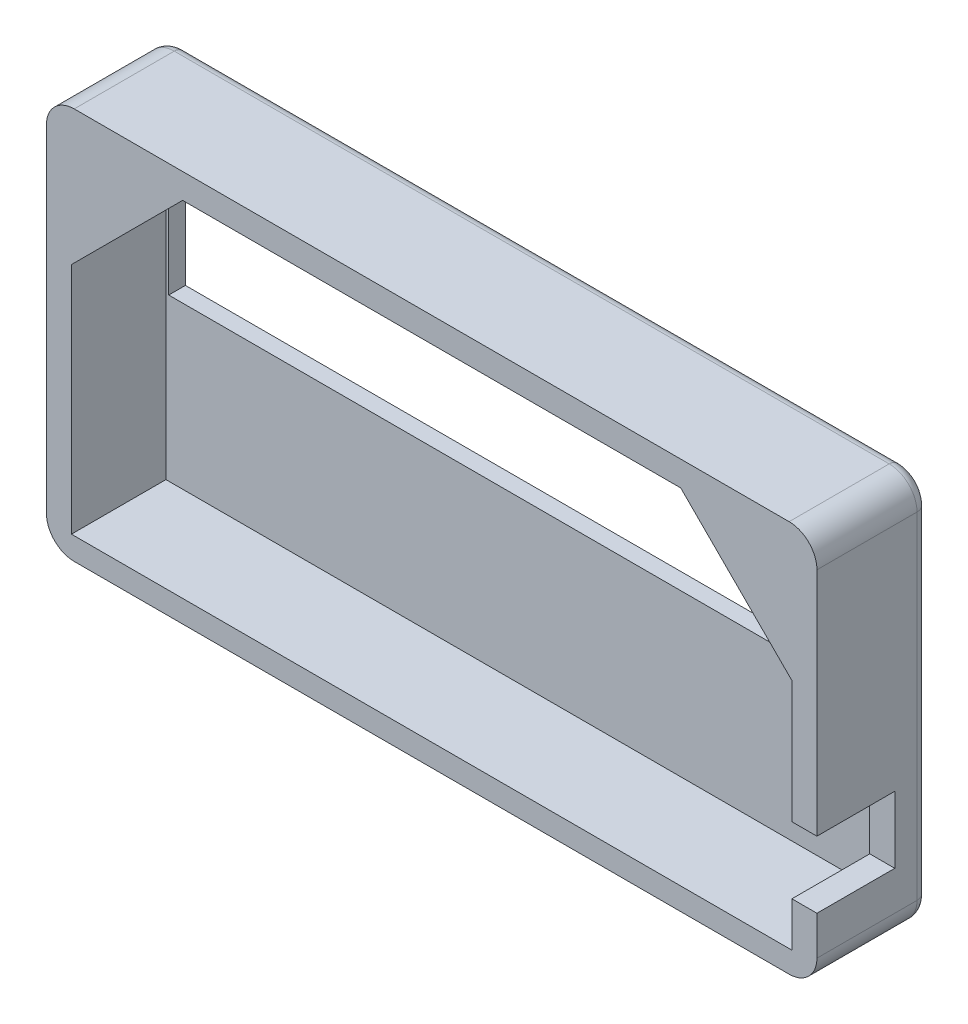
ISO-10303-21;
HEADER;
FILE_DESCRIPTION(('STEP AP214'),'2;1');
FILE_NAME('part.step','',(''),(''),'','','');
FILE_SCHEMA(('AUTOMOTIVE_DESIGN { 1 0 10303 214 1 1 1 1 }'));
ENDSEC;
DATA;
#1=APPLICATION_CONTEXT('core data for automotive mechanical design processes');
#2=APPLICATION_PROTOCOL_DEFINITION('international standard','automotive_design',2000,#1);
#3=PRODUCT_CONTEXT('',#1,'mechanical');
#4=PRODUCT('Part','Part','',(#3));
#5=PRODUCT_RELATED_PRODUCT_CATEGORY('part','',(#4));
#6=PRODUCT_DEFINITION_FORMATION('','',#4);
#7=PRODUCT_DEFINITION_CONTEXT('part definition',#1,'design');
#8=PRODUCT_DEFINITION('design','',#6,#7);
#9=PRODUCT_DEFINITION_SHAPE('','',#8);
#10=(LENGTH_UNIT() NAMED_UNIT(*) SI_UNIT(.MILLI.,.METRE.));
#11=(NAMED_UNIT(*) PLANE_ANGLE_UNIT() SI_UNIT($,.RADIAN.));
#12=(NAMED_UNIT(*) SI_UNIT($,.STERADIAN.) SOLID_ANGLE_UNIT());
#13=UNCERTAINTY_MEASURE_WITH_UNIT(LENGTH_MEASURE(1.E-05),#10,'distance_accuracy_value','');
#14=(GEOMETRIC_REPRESENTATION_CONTEXT(3) GLOBAL_UNCERTAINTY_ASSIGNED_CONTEXT((#13)) GLOBAL_UNIT_ASSIGNED_CONTEXT((#10,
#11,#12)) REPRESENTATION_CONTEXT('',''));
#15=CARTESIAN_POINT('',(0.,0.,0.));
#16=DIRECTION('',(0.,0.,1.));
#17=DIRECTION('',(1.,0.,0.));
#18=AXIS2_PLACEMENT_3D('',#15,#16,#17);
#19=CARTESIAN_POINT('',(48.352508361204,9.56521739130433,20.));
#20=DIRECTION('',(-1.,0.,0.));
#21=DIRECTION('',(0.,0.,1.));
#22=AXIS2_PLACEMENT_3D('',#19,#20,#21);
#23=PLANE('',#22);
#24=DIRECTION('',(0.,0.,-1.));
#25=VECTOR('',#24,1.);
#26=CARTESIAN_POINT('',(48.352508361204,9.56521739130433,20.));
#27=LINE('',#26,#25);
#28=CARTESIAN_POINT('',(48.352508361204,9.56521739130433,3.));
#29=VERTEX_POINT('',#28);
#30=CARTESIAN_POINT('',(48.352508361204,9.56521739130433,0.));
#31=VERTEX_POINT('',#30);
#32=EDGE_CURVE('E338',#29,#31,#27,.T.);
#33=ORIENTED_EDGE('',*,*,#32,.F.);
#34=DIRECTION('',(0.,1.,0.));
#35=VECTOR('',#34,1.);
#36=CARTESIAN_POINT('',(48.352508361204,9.56521739130433,3.));
#37=LINE('',#36,#35);
#38=CARTESIAN_POINT('',(48.352508361204,42.0652173913043,3.));
#39=VERTEX_POINT('',#38);
#40=EDGE_CURVE('E323',#29,#39,#37,.T.);
#41=ORIENTED_EDGE('',*,*,#40,.T.);
#42=DIRECTION('',(0.,0.,-1.));
#43=VECTOR('',#42,1.);
#44=CARTESIAN_POINT('',(48.352508361204,42.0652173913043,20.));
#45=LINE('',#44,#43);
#46=CARTESIAN_POINT('',(48.352508361204,42.0652173913043,0.));
#47=VERTEX_POINT('',#46);
#48=EDGE_CURVE('E344',#39,#47,#45,.T.);
#49=ORIENTED_EDGE('',*,*,#48,.T.);
#50=DIRECTION('',(0.,1.,0.));
#51=VECTOR('',#50,1.);
#52=CARTESIAN_POINT('',(48.352508361204,9.56521739130433,0.));
#53=LINE('',#52,#51);
#54=EDGE_CURVE('E326',#31,#47,#53,.T.);
#55=ORIENTED_EDGE('',*,*,#54,.F.);
#56=EDGE_LOOP('',(#33,#41,#49,#55));
#57=FACE_BOUND('',#56,.T.);
#58=ADVANCED_FACE('F39',(#57),#23,.T.);
#59=CARTESIAN_POINT('',(-80.247491638796,42.0652173913043,20.));
#60=DIRECTION('',(0.,-1.,0.));
#61=DIRECTION('',(0.,0.,-1.));
#62=AXIS2_PLACEMENT_3D('',#59,#60,#61);
#63=PLANE('',#62);
#64=ORIENTED_EDGE('',*,*,#48,.F.);
#65=DIRECTION('',(-1.,0.,0.));
#66=VECTOR('',#65,1.);
#67=CARTESIAN_POINT('',(-80.247491638796,42.0652173913043,3.));
#68=LINE('',#67,#66);
#69=CARTESIAN_POINT('',(-80.247491638796,42.0652173913043,3.));
#70=VERTEX_POINT('',#69);
#71=EDGE_CURVE('E320',#39,#70,#68,.T.);
#72=ORIENTED_EDGE('',*,*,#71,.T.);
#73=DIRECTION('',(0.,0.,-1.));
#74=VECTOR('',#73,1.);
#75=CARTESIAN_POINT('',(-80.247491638796,42.0652173913043,20.));
#76=LINE('',#75,#74);
#77=CARTESIAN_POINT('',(-80.247491638796,42.0652173913043,0.));
#78=VERTEX_POINT('',#77);
#79=EDGE_CURVE('E342',#70,#78,#76,.T.);
#80=ORIENTED_EDGE('',*,*,#79,.T.);
#81=DIRECTION('',(-1.,0.,0.));
#82=VECTOR('',#81,1.);
#83=CARTESIAN_POINT('',(-80.247491638796,42.0652173913043,0.));
#84=LINE('',#83,#82);
#85=EDGE_CURVE('E329',#47,#78,#84,.T.);
#86=ORIENTED_EDGE('',*,*,#85,.F.);
#87=EDGE_LOOP('',(#64,#72,#80,#86));
#88=FACE_BOUND('',#87,.T.);
#89=ADVANCED_FACE('F516',(#88),#63,.T.);
#90=CARTESIAN_POINT('',(-80.247491638796,9.56521739130433,20.));
#91=DIRECTION('',(1.,0.,0.));
#92=DIRECTION('',(0.,0.,-1.));
#93=AXIS2_PLACEMENT_3D('',#90,#91,#92);
#94=PLANE('',#93);
#95=ORIENTED_EDGE('',*,*,#79,.F.);
#96=DIRECTION('',(0.,-1.,0.));
#97=VECTOR('',#96,1.);
#98=CARTESIAN_POINT('',(-80.247491638796,9.56521739130433,3.));
#99=LINE('',#98,#97);
#100=CARTESIAN_POINT('',(-80.247491638796,9.56521739130433,3.));
#101=VERTEX_POINT('',#100);
#102=EDGE_CURVE('E317',#70,#101,#99,.T.);
#103=ORIENTED_EDGE('',*,*,#102,.T.);
#104=DIRECTION('',(0.,0.,-1.));
#105=VECTOR('',#104,1.);
#106=CARTESIAN_POINT('',(-80.247491638796,9.56521739130433,20.));
#107=LINE('',#106,#105);
#108=CARTESIAN_POINT('',(-80.247491638796,9.56521739130433,0.));
#109=VERTEX_POINT('',#108);
#110=EDGE_CURVE('E340',#101,#109,#107,.T.);
#111=ORIENTED_EDGE('',*,*,#110,.T.);
#112=DIRECTION('',(0.,-1.,0.));
#113=VECTOR('',#112,1.);
#114=CARTESIAN_POINT('',(-80.247491638796,9.56521739130433,0.));
#115=LINE('',#114,#113);
#116=EDGE_CURVE('E332',#78,#109,#115,.T.);
#117=ORIENTED_EDGE('',*,*,#116,.F.);
#118=EDGE_LOOP('',(#95,#103,#111,#117));
#119=FACE_BOUND('',#118,.T.);
#120=ADVANCED_FACE('F522',(#119),#94,.T.);
#121=CARTESIAN_POINT('',(-80.247491638796,9.56521739130433,20.));
#122=DIRECTION('',(0.,1.,0.));
#123=DIRECTION('',(0.,0.,1.));
#124=AXIS2_PLACEMENT_3D('',#121,#122,#123);
#125=PLANE('',#124);
#126=ORIENTED_EDGE('',*,*,#110,.F.);
#127=DIRECTION('',(1.,0.,0.));
#128=VECTOR('',#127,1.);
#129=CARTESIAN_POINT('',(-80.247491638796,9.56521739130433,3.));
#130=LINE('',#129,#128);
#131=EDGE_CURVE('E359',#101,#29,#130,.T.);
#132=ORIENTED_EDGE('',*,*,#131,.T.);
#133=ORIENTED_EDGE('',*,*,#32,.T.);
#134=DIRECTION('',(1.,0.,0.));
#135=VECTOR('',#134,1.);
#136=CARTESIAN_POINT('',(-80.247491638796,9.56521739130433,0.));
#137=LINE('',#136,#135);
#138=EDGE_CURVE('E335',#109,#31,#137,.T.);
#139=ORIENTED_EDGE('',*,*,#138,.F.);
#140=EDGE_LOOP('',(#126,#132,#133,#139));
#141=FACE_BOUND('',#140,.T.);
#142=ADVANCED_FACE('F529',(#141),#125,.T.);
#143=CARTESIAN_POINT('',(0.,0.,20.));
#144=DIRECTION('',(0.,0.,1.));
#145=DIRECTION('',(1.,0.,0.));
#146=AXIS2_PLACEMENT_3D('',#143,#144,#145);
#147=PLANE('',#146);
#148=DIRECTION('',(-1.,0.,0.));
#149=VECTOR('',#148,1.);
#150=CARTESIAN_POINT('',(-80.747491638796,42.5652173913043,20.));
#151=LINE('',#150,#149);
#152=CARTESIAN_POINT('',(28.852508361204,42.5652173913043,20.));
#153=VERTEX_POINT('',#152);
#154=CARTESIAN_POINT('',(-60.747491638796,42.5652173913043,20.));
#155=VERTEX_POINT('',#154);
#156=EDGE_CURVE('E305',#153,#155,#151,.T.);
#157=ORIENTED_EDGE('',*,*,#156,.F.);
#158=DIRECTION('',(0.707106781186551,-0.707106781186544,0.));
#159=VECTOR('',#158,1.);
#160=CARTESIAN_POINT('',(28.852508361204,42.5652173913043,20.));
#161=LINE('',#160,#159);
#162=CARTESIAN_POINT('',(48.852508361204,22.5652173913045,20.));
#163=VERTEX_POINT('',#162);
#164=EDGE_CURVE('E236',#153,#163,#161,.T.);
#165=ORIENTED_EDGE('',*,*,#164,.T.);
#166=DIRECTION('',(0.,1.,0.));
#167=VECTOR('',#166,1.);
#168=CARTESIAN_POINT('',(48.852508361204,42.5652173913043,20.));
#169=LINE('',#168,#167);
#170=CARTESIAN_POINT('',(48.852508361204,0.565217391304329,20.));
#171=VERTEX_POINT('',#170);
#172=EDGE_CURVE('E231',#171,#163,#169,.T.);
#173=ORIENTED_EDGE('',*,*,#172,.F.);
#174=DIRECTION('',(-1.,0.,0.));
#175=VECTOR('',#174,1.);
#176=CARTESIAN_POINT('',(53.352508361204,0.565217391304329,20.));
#177=LINE('',#176,#175);
#178=CARTESIAN_POINT('',(53.352508361204,0.565217391304329,20.));
#179=VERTEX_POINT('',#178);
#180=EDGE_CURVE('E265',#179,#171,#177,.T.);
#181=ORIENTED_EDGE('',*,*,#180,.F.);
#182=DIRECTION('',(0.,1.,0.));
#183=VECTOR('',#182,1.);
#184=CARTESIAN_POINT('',(53.352508361204,47.0652173913043,20.));
#185=LINE('',#184,#183);
#186=CARTESIAN_POINT('',(53.352508361204,42.0652173913043,20.));
#187=VERTEX_POINT('',#186);
#188=EDGE_CURVE('E352',#179,#187,#185,.T.);
#189=ORIENTED_EDGE('',*,*,#188,.T.);
#190=CARTESIAN_POINT('',(48.352508361204,42.0652173913043,20.));
#191=DIRECTION('',(0.,0.,1.));
#192=DIRECTION('',(1.,0.,0.));
#193=AXIS2_PLACEMENT_3D('',#190,#191,#192);
#194=CIRCLE('',#193,5.);
#195=CARTESIAN_POINT('',(48.352508361204,47.0652173913043,20.));
#196=VERTEX_POINT('',#195);
#197=EDGE_CURVE('E379',#187,#196,#194,.T.);
#198=ORIENTED_EDGE('',*,*,#197,.T.);
#199=DIRECTION('',(-1.,0.,0.));
#200=VECTOR('',#199,1.);
#201=CARTESIAN_POINT('',(-85.247491638796,47.0652173913043,20.));
#202=LINE('',#201,#200);
#203=CARTESIAN_POINT('',(-80.247491638796,47.0652173913043,20.));
#204=VERTEX_POINT('',#203);
#205=EDGE_CURVE('E356',#196,#204,#202,.T.);
#206=ORIENTED_EDGE('',*,*,#205,.T.);
#207=CARTESIAN_POINT('',(-80.247491638796,42.0652173913043,20.));
#208=DIRECTION('',(0.,0.,1.));
#209=DIRECTION('',(1.,0.,0.));
#210=AXIS2_PLACEMENT_3D('',#207,#208,#209);
#211=CIRCLE('',#210,5.);
#212=CARTESIAN_POINT('',(-85.247491638796,42.0652173913043,20.));
#213=VERTEX_POINT('',#212);
#214=EDGE_CURVE('E377',#204,#213,#211,.T.);
#215=ORIENTED_EDGE('',*,*,#214,.T.);
#216=DIRECTION('',(0.,-1.,0.));
#217=VECTOR('',#216,1.);
#218=CARTESIAN_POINT('',(-85.247491638796,47.0652173913043,20.));
#219=LINE('',#218,#217);
#220=CARTESIAN_POINT('',(-85.247491638796,-18.4347826086957,20.));
#221=VERTEX_POINT('',#220);
#222=EDGE_CURVE('E346',#213,#221,#219,.T.);
#223=ORIENTED_EDGE('',*,*,#222,.T.);
#224=CARTESIAN_POINT('',(-80.247491638796,-18.4347826086957,20.));
#225=DIRECTION('',(0.,0.,1.));
#226=DIRECTION('',(1.,0.,0.));
#227=AXIS2_PLACEMENT_3D('',#224,#225,#226);
#228=CIRCLE('',#227,5.);
#229=CARTESIAN_POINT('',(-80.247491638796,-23.4347826086957,20.));
#230=VERTEX_POINT('',#229);
#231=EDGE_CURVE('E375',#221,#230,#228,.T.);
#232=ORIENTED_EDGE('',*,*,#231,.T.);
#233=DIRECTION('',(1.,0.,0.));
#234=VECTOR('',#233,1.);
#235=CARTESIAN_POINT('',(-85.247491638796,-23.4347826086957,20.));
#236=LINE('',#235,#234);
#237=CARTESIAN_POINT('',(48.352508361204,-23.4347826086957,20.));
#238=VERTEX_POINT('',#237);
#239=EDGE_CURVE('E349',#230,#238,#236,.T.);
#240=ORIENTED_EDGE('',*,*,#239,.T.);
#241=CARTESIAN_POINT('',(48.352508361204,-18.4347826086957,20.));
#242=DIRECTION('',(0.,0.,1.));
#243=DIRECTION('',(1.,0.,0.));
#244=AXIS2_PLACEMENT_3D('',#241,#242,#243);
#245=CIRCLE('',#244,5.);
#246=CARTESIAN_POINT('',(53.352508361204,-18.4347826086957,20.));
#247=VERTEX_POINT('',#246);
#248=EDGE_CURVE('E373',#238,#247,#245,.T.);
#249=ORIENTED_EDGE('',*,*,#248,.T.);
#250=CARTESIAN_POINT('',(53.352508361204,-11.4347826086957,20.));
#251=VERTEX_POINT('',#250);
#252=EDGE_CURVE('E353',#247,#251,#185,.T.);
#253=ORIENTED_EDGE('',*,*,#252,.T.);
#254=DIRECTION('',(1.,0.,0.));
#255=VECTOR('',#254,1.);
#256=CARTESIAN_POINT('',(53.352508361204,-11.4347826086957,20.));
#257=LINE('',#256,#255);
#258=CARTESIAN_POINT('',(48.852508361204,-11.4347826086957,20.));
#259=VERTEX_POINT('',#258);
#260=EDGE_CURVE('E277',#259,#251,#257,.T.);
#261=ORIENTED_EDGE('',*,*,#260,.F.);
#262=CARTESIAN_POINT('',(48.852508361204,-19.4347826086957,20.));
#263=VERTEX_POINT('',#262);
#264=EDGE_CURVE('E302',#263,#259,#169,.T.);
#265=ORIENTED_EDGE('',*,*,#264,.F.);
#266=DIRECTION('',(1.,0.,0.));
#267=VECTOR('',#266,1.);
#268=CARTESIAN_POINT('',(-80.747491638796,-19.4347826086957,20.));
#269=LINE('',#268,#267);
#270=CARTESIAN_POINT('',(-80.747491638796,-19.4347826086957,20.));
#271=VERTEX_POINT('',#270);
#272=EDGE_CURVE('E299',#271,#263,#269,.T.);
#273=ORIENTED_EDGE('',*,*,#272,.F.);
#274=DIRECTION('',(0.,-1.,0.));
#275=VECTOR('',#274,1.);
#276=CARTESIAN_POINT('',(-80.747491638796,42.5652173913043,20.));
#277=LINE('',#276,#275);
#278=CARTESIAN_POINT('',(-80.747491638796,22.5652173913045,20.));
#279=VERTEX_POINT('',#278);
#280=EDGE_CURVE('E297',#279,#271,#277,.T.);
#281=ORIENTED_EDGE('',*,*,#280,.F.);
#282=DIRECTION('',(0.707106781186551,0.707106781186544,0.));
#283=VECTOR('',#282,1.);
#284=CARTESIAN_POINT('',(-60.747491638796,42.5652173913043,20.));
#285=LINE('',#284,#283);
#286=EDGE_CURVE('E241',#279,#155,#285,.T.);
#287=ORIENTED_EDGE('',*,*,#286,.T.);
#288=EDGE_LOOP('',(#157,#165,#173,#181,#189,#198,#206,#215,#223,#232,#240,#249,#253,#261,#265,
#273,#281,#287));
#289=FACE_BOUND('',#288,.T.);
#290=ADVANCED_FACE('F463',(#289),#147,.T.);
#291=CARTESIAN_POINT('',(0.,0.,0.));
#292=DIRECTION('',(0.,0.,1.));
#293=DIRECTION('',(1.,0.,0.));
#294=AXIS2_PLACEMENT_3D('',#291,#292,#293);
#295=PLANE('',#294);
#296=DIRECTION('',(-1.,0.,0.));
#297=VECTOR('',#296,1.);
#298=CARTESIAN_POINT('',(0.,45.0652173913043,0.));
#299=LINE('',#298,#297);
#300=CARTESIAN_POINT('',(-80.247491638796,45.0652173913043,0.));
#301=VERTEX_POINT('',#300);
#302=CARTESIAN_POINT('',(48.352508361204,45.0652173913043,0.));
#303=VERTEX_POINT('',#302);
#304=EDGE_CURVE('E391',#301,#303,#299,.F.);
#305=ORIENTED_EDGE('',*,*,#304,.T.);
#306=CARTESIAN_POINT('',(48.352508361204,42.0652173913043,0.));
#307=DIRECTION('',(0.,0.,1.));
#308=DIRECTION('',(1.,0.,0.));
#309=AXIS2_PLACEMENT_3D('',#306,#307,#308);
#310=CIRCLE('',#309,3.);
#311=CARTESIAN_POINT('',(51.352508361204,42.0652173913043,0.));
#312=VERTEX_POINT('',#311);
#313=EDGE_CURVE('E405',#303,#312,#310,.F.);
#314=ORIENTED_EDGE('',*,*,#313,.T.);
#315=DIRECTION('',(0.,1.,0.));
#316=VECTOR('',#315,1.);
#317=CARTESIAN_POINT('',(51.352508361204,0.,0.));
#318=LINE('',#317,#316);
#319=CARTESIAN_POINT('',(51.352508361204,-18.4347826086957,0.));
#320=VERTEX_POINT('',#319);
#321=EDGE_CURVE('E403',#312,#320,#318,.F.);
#322=ORIENTED_EDGE('',*,*,#321,.T.);
#323=CARTESIAN_POINT('',(48.352508361204,-18.4347826086957,0.));
#324=DIRECTION('',(0.,0.,1.));
#325=DIRECTION('',(1.,0.,0.));
#326=AXIS2_PLACEMENT_3D('',#323,#324,#325);
#327=CIRCLE('',#326,3.);
#328=CARTESIAN_POINT('',(48.352508361204,-21.4347826086957,0.));
#329=VERTEX_POINT('',#328);
#330=EDGE_CURVE('E401',#320,#329,#327,.F.);
#331=ORIENTED_EDGE('',*,*,#330,.T.);
#332=DIRECTION('',(1.,0.,0.));
#333=VECTOR('',#332,1.);
#334=CARTESIAN_POINT('',(0.,-21.4347826086957,0.));
#335=LINE('',#334,#333);
#336=CARTESIAN_POINT('',(-80.247491638796,-21.4347826086957,0.));
#337=VERTEX_POINT('',#336);
#338=EDGE_CURVE('E399',#329,#337,#335,.F.);
#339=ORIENTED_EDGE('',*,*,#338,.T.);
#340=CARTESIAN_POINT('',(-80.247491638796,-18.4347826086957,0.));
#341=DIRECTION('',(0.,0.,1.));
#342=DIRECTION('',(1.,0.,0.));
#343=AXIS2_PLACEMENT_3D('',#340,#341,#342);
#344=CIRCLE('',#343,3.);
#345=CARTESIAN_POINT('',(-83.247491638796,-18.4347826086957,0.));
#346=VERTEX_POINT('',#345);
#347=EDGE_CURVE('E397',#337,#346,#344,.F.);
#348=ORIENTED_EDGE('',*,*,#347,.T.);
#349=DIRECTION('',(0.,-1.,0.));
#350=VECTOR('',#349,1.);
#351=CARTESIAN_POINT('',(-83.247491638796,0.,0.));
#352=LINE('',#351,#350);
#353=CARTESIAN_POINT('',(-83.247491638796,42.0652173913043,0.));
#354=VERTEX_POINT('',#353);
#355=EDGE_CURVE('E395',#346,#354,#352,.F.);
#356=ORIENTED_EDGE('',*,*,#355,.T.);
#357=CARTESIAN_POINT('',(-80.247491638796,42.0652173913043,0.));
#358=DIRECTION('',(0.,0.,1.));
#359=DIRECTION('',(1.,0.,0.));
#360=AXIS2_PLACEMENT_3D('',#357,#358,#359);
#361=CIRCLE('',#360,3.);
#362=EDGE_CURVE('E393',#354,#301,#361,.F.);
#363=ORIENTED_EDGE('',*,*,#362,.T.);
#364=EDGE_LOOP('',(#305,#314,#322,#331,#339,#348,#356,#363));
#365=FACE_BOUND('',#364,.T.);
#366=ORIENTED_EDGE('',*,*,#54,.T.);
#367=ORIENTED_EDGE('',*,*,#85,.T.);
#368=ORIENTED_EDGE('',*,*,#116,.T.);
#369=ORIENTED_EDGE('',*,*,#138,.T.);
#370=EDGE_LOOP('',(#366,#367,#368,#369));
#371=FACE_BOUND('',#370,.T.);
#372=ADVANCED_FACE('F505',(#365,#371),#295,.F.);
#373=CARTESIAN_POINT('',(-85.247491638796,47.0652173913043,20.));
#374=DIRECTION('',(1.,0.,0.));
#375=DIRECTION('',(0.,1.,0.));
#376=AXIS2_PLACEMENT_3D('',#373,#374,#375);
#377=PLANE('',#376);
#378=DIRECTION('',(0.,0.,-1.));
#379=VECTOR('',#378,1.);
#380=CARTESIAN_POINT('',(-85.247491638796,42.0652173913043,20.));
#381=LINE('',#380,#379);
#382=CARTESIAN_POINT('',(-85.247491638796,42.0652173913043,2.));
#383=VERTEX_POINT('',#382);
#384=EDGE_CURVE('E383',#213,#383,#381,.T.);
#385=ORIENTED_EDGE('',*,*,#384,.T.);
#386=DIRECTION('',(0.,-1.,0.));
#387=VECTOR('',#386,1.);
#388=CARTESIAN_POINT('',(-85.247491638796,47.0652173913043,2.));
#389=LINE('',#388,#387);
#390=CARTESIAN_POINT('',(-85.247491638796,-18.4347826086957,2.));
#391=VERTEX_POINT('',#390);
#392=EDGE_CURVE('E419',#383,#391,#389,.T.);
#393=ORIENTED_EDGE('',*,*,#392,.T.);
#394=DIRECTION('',(0.,0.,-1.));
#395=VECTOR('',#394,1.);
#396=CARTESIAN_POINT('',(-85.247491638796,-18.4347826086957,20.));
#397=LINE('',#396,#395);
#398=EDGE_CURVE('E381',#391,#221,#397,.F.);
#399=ORIENTED_EDGE('',*,*,#398,.T.);
#400=ORIENTED_EDGE('',*,*,#222,.F.);
#401=EDGE_LOOP('',(#385,#393,#399,#400));
#402=FACE_BOUND('',#401,.T.);
#403=ADVANCED_FACE('F503',(#402),#377,.F.);
#404=CARTESIAN_POINT('',(-85.247491638796,-23.4347826086957,20.));
#405=DIRECTION('',(0.,1.,0.));
#406=DIRECTION('',(0.,0.,1.));
#407=AXIS2_PLACEMENT_3D('',#404,#405,#406);
#408=PLANE('',#407);
#409=DIRECTION('',(0.,0.,-1.));
#410=VECTOR('',#409,1.);
#411=CARTESIAN_POINT('',(-80.247491638796,-23.4347826086957,20.));
#412=LINE('',#411,#410);
#413=CARTESIAN_POINT('',(-80.247491638796,-23.4347826086957,2.));
#414=VERTEX_POINT('',#413);
#415=EDGE_CURVE('E388',#230,#414,#412,.T.);
#416=ORIENTED_EDGE('',*,*,#415,.T.);
#417=DIRECTION('',(1.,0.,0.));
#418=VECTOR('',#417,1.);
#419=CARTESIAN_POINT('',(-85.247491638796,-23.4347826086957,2.));
#420=LINE('',#419,#418);
#421=CARTESIAN_POINT('',(48.352508361204,-23.4347826086957,2.));
#422=VERTEX_POINT('',#421);
#423=EDGE_CURVE('E415',#414,#422,#420,.T.);
#424=ORIENTED_EDGE('',*,*,#423,.T.);
#425=DIRECTION('',(0.,0.,-1.));
#426=VECTOR('',#425,1.);
#427=CARTESIAN_POINT('',(48.352508361204,-23.4347826086957,20.));
#428=LINE('',#427,#426);
#429=EDGE_CURVE('E386',#422,#238,#428,.F.);
#430=ORIENTED_EDGE('',*,*,#429,.T.);
#431=ORIENTED_EDGE('',*,*,#239,.F.);
#432=EDGE_LOOP('',(#416,#424,#430,#431));
#433=FACE_BOUND('',#432,.T.);
#434=ADVANCED_FACE('F459',(#433),#408,.F.);
#435=CARTESIAN_POINT('',(53.352508361204,47.0652173913043,20.));
#436=DIRECTION('',(-1.,0.,0.));
#437=DIRECTION('',(0.,-1.,0.));
#438=AXIS2_PLACEMENT_3D('',#435,#436,#437);
#439=PLANE('',#438);
#440=DIRECTION('',(0.,-1.,0.));
#441=VECTOR('',#440,1.);
#442=CARTESIAN_POINT('',(53.352508361204,-11.4347826086957,6.));
#443=LINE('',#442,#441);
#444=CARTESIAN_POINT('',(53.352508361204,0.565217391304329,6.));
#445=VERTEX_POINT('',#444);
#446=CARTESIAN_POINT('',(53.352508361204,-11.4347826086957,6.));
#447=VERTEX_POINT('',#446);
#448=EDGE_CURVE('E272',#445,#447,#443,.T.);
#449=ORIENTED_EDGE('',*,*,#448,.T.);
#450=DIRECTION('',(0.,0.,1.));
#451=VECTOR('',#450,1.);
#452=CARTESIAN_POINT('',(53.352508361204,-11.4347826086957,-9.81600561797629));
#453=LINE('',#452,#451);
#454=EDGE_CURVE('E270',#447,#251,#453,.T.);
#455=ORIENTED_EDGE('',*,*,#454,.T.);
#456=ORIENTED_EDGE('',*,*,#252,.F.);
#457=DIRECTION('',(0.,0.,-1.));
#458=VECTOR('',#457,1.);
#459=CARTESIAN_POINT('',(53.352508361204,-18.4347826086957,20.));
#460=LINE('',#459,#458);
#461=CARTESIAN_POINT('',(53.352508361204,-18.4347826086957,2.));
#462=VERTEX_POINT('',#461);
#463=EDGE_CURVE('E367',#247,#462,#460,.T.);
#464=ORIENTED_EDGE('',*,*,#463,.T.);
#465=DIRECTION('',(0.,1.,0.));
#466=VECTOR('',#465,1.);
#467=CARTESIAN_POINT('',(53.352508361204,47.0652173913043,2.));
#468=LINE('',#467,#466);
#469=CARTESIAN_POINT('',(53.352508361204,42.0652173913043,2.));
#470=VERTEX_POINT('',#469);
#471=EDGE_CURVE('E411',#462,#470,#468,.T.);
#472=ORIENTED_EDGE('',*,*,#471,.T.);
#473=DIRECTION('',(0.,0.,-1.));
#474=VECTOR('',#473,1.);
#475=CARTESIAN_POINT('',(53.352508361204,42.0652173913043,20.));
#476=LINE('',#475,#474);
#477=EDGE_CURVE('E370',#470,#187,#476,.F.);
#478=ORIENTED_EDGE('',*,*,#477,.T.);
#479=ORIENTED_EDGE('',*,*,#188,.F.);
#480=DIRECTION('',(0.,0.,1.));
#481=VECTOR('',#480,1.);
#482=CARTESIAN_POINT('',(53.352508361204,0.565217391304329,-9.81600561797629));
#483=LINE('',#482,#481);
#484=EDGE_CURVE('E279',#445,#179,#483,.T.);
#485=ORIENTED_EDGE('',*,*,#484,.F.);
#486=EDGE_LOOP('',(#449,#455,#456,#464,#472,#478,#479,#485));
#487=FACE_BOUND('',#486,.T.);
#488=ADVANCED_FACE('F472',(#487),#439,.F.);
#489=CARTESIAN_POINT('',(-85.247491638796,47.0652173913043,20.));
#490=DIRECTION('',(0.,-1.,0.));
#491=DIRECTION('',(0.,0.,-1.));
#492=AXIS2_PLACEMENT_3D('',#489,#490,#491);
#493=PLANE('',#492);
#494=DIRECTION('',(0.,0.,-1.));
#495=VECTOR('',#494,1.);
#496=CARTESIAN_POINT('',(48.352508361204,47.0652173913043,20.));
#497=LINE('',#496,#495);
#498=CARTESIAN_POINT('',(48.352508361204,47.0652173913043,2.));
#499=VERTEX_POINT('',#498);
#500=EDGE_CURVE('E364',#196,#499,#497,.T.);
#501=ORIENTED_EDGE('',*,*,#500,.T.);
#502=DIRECTION('',(-1.,0.,0.));
#503=VECTOR('',#502,1.);
#504=CARTESIAN_POINT('',(-85.247491638796,47.0652173913043,2.));
#505=LINE('',#504,#503);
#506=CARTESIAN_POINT('',(-80.247491638796,47.0652173913043,2.));
#507=VERTEX_POINT('',#506);
#508=EDGE_CURVE('E13',#499,#507,#505,.T.);
#509=ORIENTED_EDGE('',*,*,#508,.T.);
#510=DIRECTION('',(0.,0.,-1.));
#511=VECTOR('',#510,1.);
#512=CARTESIAN_POINT('',(-80.247491638796,47.0652173913043,20.));
#513=LINE('',#512,#511);
#514=EDGE_CURVE('E362',#507,#204,#513,.F.);
#515=ORIENTED_EDGE('',*,*,#514,.T.);
#516=ORIENTED_EDGE('',*,*,#205,.F.);
#517=EDGE_LOOP('',(#501,#509,#515,#516));
#518=FACE_BOUND('',#517,.T.);
#519=ADVANCED_FACE('F494',(#518),#493,.F.);
#520=CARTESIAN_POINT('',(-80.747491638796,42.5652173913043,-143.666836813511));
#521=DIRECTION('',(-1.,0.,0.));
#522=DIRECTION('',(0.,-1.,0.));
#523=AXIS2_PLACEMENT_3D('',#520,#521,#522);
#524=PLANE('',#523);
#525=DIRECTION('',(0.,1.,0.));
#526=VECTOR('',#525,1.);
#527=CARTESIAN_POINT('',(-80.747491638796,22.5652173913045,18.));
#528=LINE('',#527,#526);
#529=CARTESIAN_POINT('',(-80.747491638796,22.5652173913045,18.));
#530=VERTEX_POINT('',#529);
#531=CARTESIAN_POINT('',(-80.747491638796,42.5652173913043,18.));
#532=VERTEX_POINT('',#531);
#533=EDGE_CURVE('E256',#530,#532,#528,.T.);
#534=ORIENTED_EDGE('',*,*,#533,.F.);
#535=DIRECTION('',(0.,0.,1.));
#536=VECTOR('',#535,1.);
#537=CARTESIAN_POINT('',(-80.747491638796,22.5652173913045,-25.2842712474618));
#538=LINE('',#537,#536);
#539=EDGE_CURVE('E259',#530,#279,#538,.T.);
#540=ORIENTED_EDGE('',*,*,#539,.T.);
#541=ORIENTED_EDGE('',*,*,#280,.T.);
#542=DIRECTION('',(0.,0.,1.));
#543=VECTOR('',#542,1.);
#544=CARTESIAN_POINT('',(-80.747491638796,-19.4347826086957,-143.666836813511));
#545=LINE('',#544,#543);
#546=CARTESIAN_POINT('',(-80.747491638796,-19.4347826086957,3.));
#547=VERTEX_POINT('',#546);
#548=EDGE_CURVE('E307',#547,#271,#545,.T.);
#549=ORIENTED_EDGE('',*,*,#548,.F.);
#550=DIRECTION('',(0.,1.,0.));
#551=VECTOR('',#550,1.);
#552=CARTESIAN_POINT('',(-80.747491638796,42.5652173913043,3.));
#553=LINE('',#552,#551);
#554=CARTESIAN_POINT('',(-80.747491638796,42.5652173913043,3.));
#555=VERTEX_POINT('',#554);
#556=EDGE_CURVE('E294',#547,#555,#553,.T.);
#557=ORIENTED_EDGE('',*,*,#556,.T.);
#558=DIRECTION('',(0.,0.,1.));
#559=VECTOR('',#558,1.);
#560=CARTESIAN_POINT('',(-80.747491638796,42.5652173913043,-143.666836813511));
#561=LINE('',#560,#559);
#562=EDGE_CURVE('E292',#555,#532,#561,.T.);
#563=ORIENTED_EDGE('',*,*,#562,.T.);
#564=EDGE_LOOP('',(#534,#540,#541,#549,#557,#563));
#565=FACE_BOUND('',#564,.T.);
#566=ADVANCED_FACE('F533',(#565),#524,.F.);
#567=CARTESIAN_POINT('',(-80.747491638796,42.5652173913043,-143.666836813511));
#568=DIRECTION('',(0.,1.,0.));
#569=DIRECTION('',(0.,0.,1.));
#570=AXIS2_PLACEMENT_3D('',#567,#568,#569);
#571=PLANE('',#570);
#572=DIRECTION('',(1.,0.,0.));
#573=VECTOR('',#572,1.);
#574=CARTESIAN_POINT('',(48.852508361204,42.5652173913043,18.));
#575=LINE('',#574,#573);
#576=CARTESIAN_POINT('',(28.852508361204,42.5652173913043,18.));
#577=VERTEX_POINT('',#576);
#578=CARTESIAN_POINT('',(48.852508361204,42.5652173913043,18.));
#579=VERTEX_POINT('',#578);
#580=EDGE_CURVE('E56',#577,#579,#575,.T.);
#581=ORIENTED_EDGE('',*,*,#580,.F.);
#582=DIRECTION('',(0.,0.,1.));
#583=VECTOR('',#582,1.);
#584=CARTESIAN_POINT('',(28.852508361204,42.5652173913043,-25.2842712474618));
#585=LINE('',#584,#583);
#586=EDGE_CURVE('E61',#577,#153,#585,.T.);
#587=ORIENTED_EDGE('',*,*,#586,.T.);
#588=ORIENTED_EDGE('',*,*,#156,.T.);
#589=DIRECTION('',(0.,0.,1.));
#590=VECTOR('',#589,1.);
#591=CARTESIAN_POINT('',(-60.747491638796,42.5652173913043,-25.2842712474618));
#592=LINE('',#591,#590);
#593=CARTESIAN_POINT('',(-60.747491638796,42.5652173913043,18.));
#594=VERTEX_POINT('',#593);
#595=EDGE_CURVE('E253',#594,#155,#592,.T.);
#596=ORIENTED_EDGE('',*,*,#595,.F.);
#597=DIRECTION('',(1.,0.,0.));
#598=VECTOR('',#597,1.);
#599=CARTESIAN_POINT('',(-80.747491638796,42.5652173913043,18.));
#600=LINE('',#599,#598);
#601=EDGE_CURVE('E252',#532,#594,#600,.T.);
#602=ORIENTED_EDGE('',*,*,#601,.F.);
#603=ORIENTED_EDGE('',*,*,#562,.F.);
#604=DIRECTION('',(1.,0.,0.));
#605=VECTOR('',#604,1.);
#606=CARTESIAN_POINT('',(-80.747491638796,42.5652173913043,3.));
#607=LINE('',#606,#605);
#608=CARTESIAN_POINT('',(48.852508361204,42.5652173913043,3.));
#609=VERTEX_POINT('',#608);
#610=EDGE_CURVE('E291',#555,#609,#607,.T.);
#611=ORIENTED_EDGE('',*,*,#610,.T.);
#612=DIRECTION('',(0.,0.,1.));
#613=VECTOR('',#612,1.);
#614=CARTESIAN_POINT('',(48.852508361204,42.5652173913043,-143.666836813511));
#615=LINE('',#614,#613);
#616=EDGE_CURVE('E310',#609,#579,#615,.T.);
#617=ORIENTED_EDGE('',*,*,#616,.T.);
#618=EDGE_LOOP('',(#581,#587,#588,#596,#602,#603,#611,#617));
#619=FACE_BOUND('',#618,.T.);
#620=ADVANCED_FACE('F552',(#619),#571,.F.);
#621=CARTESIAN_POINT('',(48.852508361204,42.5652173913043,-143.666836813511));
#622=DIRECTION('',(1.,0.,0.));
#623=DIRECTION('',(0.,1.,0.));
#624=AXIS2_PLACEMENT_3D('',#621,#622,#623);
#625=PLANE('',#624);
#626=ORIENTED_EDGE('',*,*,#172,.T.);
#627=DIRECTION('',(0.,0.,1.));
#628=VECTOR('',#627,1.);
#629=CARTESIAN_POINT('',(48.852508361204,22.5652173913045,-25.2842712474618));
#630=LINE('',#629,#628);
#631=CARTESIAN_POINT('',(48.852508361204,22.5652173913045,18.));
#632=VERTEX_POINT('',#631);
#633=EDGE_CURVE('E224',#632,#163,#630,.T.);
#634=ORIENTED_EDGE('',*,*,#633,.F.);
#635=DIRECTION('',(0.,-1.,0.));
#636=VECTOR('',#635,1.);
#637=CARTESIAN_POINT('',(48.852508361204,22.5652173913045,18.));
#638=LINE('',#637,#636);
#639=EDGE_CURVE('E228',#579,#632,#638,.T.);
#640=ORIENTED_EDGE('',*,*,#639,.F.);
#641=ORIENTED_EDGE('',*,*,#616,.F.);
#642=DIRECTION('',(0.,-1.,0.));
#643=VECTOR('',#642,1.);
#644=CARTESIAN_POINT('',(48.852508361204,42.5652173913043,3.));
#645=LINE('',#644,#643);
#646=CARTESIAN_POINT('',(48.852508361204,-19.4347826086957,3.));
#647=VERTEX_POINT('',#646);
#648=EDGE_CURVE('E289',#609,#647,#645,.T.);
#649=ORIENTED_EDGE('',*,*,#648,.T.);
#650=DIRECTION('',(0.,0.,1.));
#651=VECTOR('',#650,1.);
#652=CARTESIAN_POINT('',(48.852508361204,-19.4347826086957,-143.666836813511));
#653=LINE('',#652,#651);
#654=EDGE_CURVE('E312',#647,#263,#653,.T.);
#655=ORIENTED_EDGE('',*,*,#654,.T.);
#656=ORIENTED_EDGE('',*,*,#264,.T.);
#657=DIRECTION('',(0.,0.,1.));
#658=VECTOR('',#657,1.);
#659=CARTESIAN_POINT('',(48.852508361204,-11.4347826086957,-9.81600561797629));
#660=LINE('',#659,#658);
#661=CARTESIAN_POINT('',(48.852508361204,-11.4347826086957,6.));
#662=VERTEX_POINT('',#661);
#663=EDGE_CURVE('E282',#662,#259,#660,.T.);
#664=ORIENTED_EDGE('',*,*,#663,.F.);
#665=DIRECTION('',(0.,1.,0.));
#666=VECTOR('',#665,1.);
#667=CARTESIAN_POINT('',(48.852508361204,-11.4347826086957,6.));
#668=LINE('',#667,#666);
#669=CARTESIAN_POINT('',(48.852508361204,0.565217391304329,6.00000000000001));
#670=VERTEX_POINT('',#669);
#671=EDGE_CURVE('E266',#662,#670,#668,.T.);
#672=ORIENTED_EDGE('',*,*,#671,.T.);
#673=DIRECTION('',(0.,0.,1.));
#674=VECTOR('',#673,1.);
#675=CARTESIAN_POINT('',(48.852508361204,0.565217391304329,-9.81600561797629));
#676=LINE('',#675,#674);
#677=EDGE_CURVE('E284',#670,#171,#676,.T.);
#678=ORIENTED_EDGE('',*,*,#677,.T.);
#679=EDGE_LOOP('',(#626,#634,#640,#641,#649,#655,#656,#664,#672,#678));
#680=FACE_BOUND('',#679,.T.);
#681=ADVANCED_FACE('F226',(#680),#625,.F.);
#682=CARTESIAN_POINT('',(-80.747491638796,-19.4347826086957,-143.666836813511));
#683=DIRECTION('',(0.,-1.,0.));
#684=DIRECTION('',(0.,0.,-1.));
#685=AXIS2_PLACEMENT_3D('',#682,#683,#684);
#686=PLANE('',#685);
#687=DIRECTION('',(-1.,0.,0.));
#688=VECTOR('',#687,1.);
#689=CARTESIAN_POINT('',(-80.747491638796,-19.4347826086957,3.));
#690=LINE('',#689,#688);
#691=EDGE_CURVE('E296',#647,#547,#690,.T.);
#692=ORIENTED_EDGE('',*,*,#691,.T.);
#693=ORIENTED_EDGE('',*,*,#548,.T.);
#694=ORIENTED_EDGE('',*,*,#272,.T.);
#695=ORIENTED_EDGE('',*,*,#654,.F.);
#696=EDGE_LOOP('',(#692,#693,#694,#695));
#697=FACE_BOUND('',#696,.T.);
#698=ADVANCED_FACE('F567',(#697),#686,.F.);
#699=CARTESIAN_POINT('',(0.,0.,3.));
#700=DIRECTION('',(0.,0.,1.));
#701=DIRECTION('',(1.,0.,0.));
#702=AXIS2_PLACEMENT_3D('',#699,#700,#701);
#703=PLANE('',#702);
#704=ORIENTED_EDGE('',*,*,#131,.F.);
#705=ORIENTED_EDGE('',*,*,#102,.F.);
#706=ORIENTED_EDGE('',*,*,#71,.F.);
#707=ORIENTED_EDGE('',*,*,#40,.F.);
#708=EDGE_LOOP('',(#704,#705,#706,#707));
#709=FACE_BOUND('',#708,.T.);
#710=ORIENTED_EDGE('',*,*,#556,.F.);
#711=ORIENTED_EDGE('',*,*,#691,.F.);
#712=ORIENTED_EDGE('',*,*,#648,.F.);
#713=ORIENTED_EDGE('',*,*,#610,.F.);
#714=EDGE_LOOP('',(#710,#711,#712,#713));
#715=FACE_BOUND('',#714,.T.);
#716=ADVANCED_FACE('F575',(#709,#715),#703,.T.);
#717=CARTESIAN_POINT('',(48.352508361204,42.0652173913043,20.));
#718=DIRECTION('',(0.,0.,-1.));
#719=DIRECTION('',(-1.,0.,0.));
#720=AXIS2_PLACEMENT_3D('',#717,#718,#719);
#721=CYLINDRICAL_SURFACE('',#720,5.);
#722=ORIENTED_EDGE('',*,*,#477,.F.);
#723=CARTESIAN_POINT('',(48.352508361204,42.0652173913043,2.));
#724=DIRECTION('',(0.,0.,1.));
#725=DIRECTION('',(1.,0.,0.));
#726=AXIS2_PLACEMENT_3D('',#723,#724,#725);
#727=CIRCLE('',#726,5.);
#728=EDGE_CURVE('E408',#470,#499,#727,.T.);
#729=ORIENTED_EDGE('',*,*,#728,.T.);
#730=ORIENTED_EDGE('',*,*,#500,.F.);
#731=ORIENTED_EDGE('',*,*,#197,.F.);
#732=EDGE_LOOP('',(#722,#729,#730,#731));
#733=FACE_BOUND('',#732,.T.);
#734=ADVANCED_FACE('F490',(#733),#721,.T.);
#735=CARTESIAN_POINT('',(-80.247491638796,42.0652173913043,20.));
#736=DIRECTION('',(0.,0.,-1.));
#737=DIRECTION('',(-1.,0.,0.));
#738=AXIS2_PLACEMENT_3D('',#735,#736,#737);
#739=CYLINDRICAL_SURFACE('',#738,5.);
#740=ORIENTED_EDGE('',*,*,#514,.F.);
#741=CARTESIAN_POINT('',(-80.247491638796,42.0652173913043,2.));
#742=DIRECTION('',(0.,0.,1.));
#743=DIRECTION('',(1.,0.,0.));
#744=AXIS2_PLACEMENT_3D('',#741,#742,#743);
#745=CIRCLE('',#744,5.);
#746=EDGE_CURVE('E48',#507,#383,#745,.T.);
#747=ORIENTED_EDGE('',*,*,#746,.T.);
#748=ORIENTED_EDGE('',*,*,#384,.F.);
#749=ORIENTED_EDGE('',*,*,#214,.F.);
#750=EDGE_LOOP('',(#740,#747,#748,#749));
#751=FACE_BOUND('',#750,.T.);
#752=ADVANCED_FACE('F500',(#751),#739,.T.);
#753=CARTESIAN_POINT('',(-80.247491638796,-18.4347826086957,20.));
#754=DIRECTION('',(0.,0.,-1.));
#755=DIRECTION('',(-1.,0.,0.));
#756=AXIS2_PLACEMENT_3D('',#753,#754,#755);
#757=CYLINDRICAL_SURFACE('',#756,5.);
#758=ORIENTED_EDGE('',*,*,#398,.F.);
#759=CARTESIAN_POINT('',(-80.247491638796,-18.4347826086957,2.));
#760=DIRECTION('',(0.,0.,1.));
#761=DIRECTION('',(1.,0.,0.));
#762=AXIS2_PLACEMENT_3D('',#759,#760,#761);
#763=CIRCLE('',#762,5.);
#764=EDGE_CURVE('E417',#391,#414,#763,.T.);
#765=ORIENTED_EDGE('',*,*,#764,.T.);
#766=ORIENTED_EDGE('',*,*,#415,.F.);
#767=ORIENTED_EDGE('',*,*,#231,.F.);
#768=EDGE_LOOP('',(#758,#765,#766,#767));
#769=FACE_BOUND('',#768,.T.);
#770=ADVANCED_FACE('F455',(#769),#757,.T.);
#771=CARTESIAN_POINT('',(48.352508361204,-18.4347826086957,20.));
#772=DIRECTION('',(0.,0.,-1.));
#773=DIRECTION('',(-1.,0.,0.));
#774=AXIS2_PLACEMENT_3D('',#771,#772,#773);
#775=CYLINDRICAL_SURFACE('',#774,5.);
#776=ORIENTED_EDGE('',*,*,#429,.F.);
#777=CARTESIAN_POINT('',(48.352508361204,-18.4347826086957,2.));
#778=DIRECTION('',(0.,0.,1.));
#779=DIRECTION('',(1.,0.,0.));
#780=AXIS2_PLACEMENT_3D('',#777,#778,#779);
#781=CIRCLE('',#780,5.);
#782=EDGE_CURVE('E413',#422,#462,#781,.T.);
#783=ORIENTED_EDGE('',*,*,#782,.T.);
#784=ORIENTED_EDGE('',*,*,#463,.F.);
#785=ORIENTED_EDGE('',*,*,#248,.F.);
#786=EDGE_LOOP('',(#776,#783,#784,#785));
#787=FACE_BOUND('',#786,.T.);
#788=ADVANCED_FACE('F467',(#787),#775,.T.);
#789=CARTESIAN_POINT('',(-80.247491638796,-18.4347826086957,2.));
#790=DIRECTION('',(0.,0.,1.));
#791=DIRECTION('',(1.,0.,0.));
#792=AXIS2_PLACEMENT_3D('',#789,#790,#791);
#793=TOROIDAL_SURFACE('',#792,3.,2.);
#794=CARTESIAN_POINT('',(-80.247491638796,-21.4347826086957,2.));
#795=DIRECTION('',(1.,0.,0.));
#796=DIRECTION('',(0.,0.,-1.));
#797=AXIS2_PLACEMENT_3D('',#794,#795,#796);
#798=CIRCLE('',#797,2.);
#799=EDGE_CURVE('E436',#414,#337,#798,.T.);
#800=ORIENTED_EDGE('',*,*,#799,.F.);
#801=ORIENTED_EDGE('',*,*,#764,.F.);
#802=CARTESIAN_POINT('',(-83.247491638796,-18.4347826086957,2.));
#803=DIRECTION('',(0.,1.,0.));
#804=DIRECTION('',(0.,0.,1.));
#805=AXIS2_PLACEMENT_3D('',#802,#803,#804);
#806=CIRCLE('',#805,2.);
#807=EDGE_CURVE('E43',#346,#391,#806,.T.);
#808=ORIENTED_EDGE('',*,*,#807,.F.);
#809=ORIENTED_EDGE('',*,*,#347,.F.);
#810=EDGE_LOOP('',(#800,#801,#808,#809));
#811=FACE_BOUND('',#810,.T.);
#812=ADVANCED_FACE('F41',(#811),#793,.T.);
#813=CARTESIAN_POINT('',(-83.247491638796,47.0652173913043,2.));
#814=DIRECTION('',(0.,-1.,0.));
#815=DIRECTION('',(1.,0.,0.));
#816=AXIS2_PLACEMENT_3D('',#813,#814,#815);
#817=CYLINDRICAL_SURFACE('',#816,2.);
#818=ORIENTED_EDGE('',*,*,#807,.T.);
#819=ORIENTED_EDGE('',*,*,#392,.F.);
#820=CARTESIAN_POINT('',(-83.247491638796,42.0652173913043,2.));
#821=DIRECTION('',(0.,1.,0.));
#822=DIRECTION('',(0.,0.,1.));
#823=AXIS2_PLACEMENT_3D('',#820,#821,#822);
#824=CIRCLE('',#823,2.);
#825=EDGE_CURVE('E434',#354,#383,#824,.T.);
#826=ORIENTED_EDGE('',*,*,#825,.F.);
#827=ORIENTED_EDGE('',*,*,#355,.F.);
#828=EDGE_LOOP('',(#818,#819,#826,#827));
#829=FACE_BOUND('',#828,.T.);
#830=ADVANCED_FACE('F447',(#829),#817,.T.);
#831=CARTESIAN_POINT('',(-85.247491638796,-21.4347826086957,2.));
#832=DIRECTION('',(1.,0.,0.));
#833=DIRECTION('',(0.,0.,-1.));
#834=AXIS2_PLACEMENT_3D('',#831,#832,#833);
#835=CYLINDRICAL_SURFACE('',#834,2.);
#836=ORIENTED_EDGE('',*,*,#799,.T.);
#837=ORIENTED_EDGE('',*,*,#338,.F.);
#838=CARTESIAN_POINT('',(48.352508361204,-21.4347826086957,2.));
#839=DIRECTION('',(1.,0.,0.));
#840=DIRECTION('',(0.,0.,-1.));
#841=AXIS2_PLACEMENT_3D('',#838,#839,#840);
#842=CIRCLE('',#841,2.);
#843=EDGE_CURVE('E431',#422,#329,#842,.T.);
#844=ORIENTED_EDGE('',*,*,#843,.F.);
#845=ORIENTED_EDGE('',*,*,#423,.F.);
#846=EDGE_LOOP('',(#836,#837,#844,#845));
#847=FACE_BOUND('',#846,.T.);
#848=ADVANCED_FACE('F619',(#847),#835,.T.);
#849=CARTESIAN_POINT('',(-80.247491638796,42.0652173913043,2.));
#850=DIRECTION('',(0.,0.,1.));
#851=DIRECTION('',(1.,0.,0.));
#852=AXIS2_PLACEMENT_3D('',#849,#850,#851);
#853=TOROIDAL_SURFACE('',#852,3.,2.);
#854=ORIENTED_EDGE('',*,*,#825,.T.);
#855=ORIENTED_EDGE('',*,*,#746,.F.);
#856=CARTESIAN_POINT('',(-80.247491638796,45.0652173913043,2.));
#857=DIRECTION('',(1.,0.,0.));
#858=DIRECTION('',(0.,0.,-1.));
#859=AXIS2_PLACEMENT_3D('',#856,#857,#858);
#860=CIRCLE('',#859,2.);
#861=EDGE_CURVE('E428',#301,#507,#860,.T.);
#862=ORIENTED_EDGE('',*,*,#861,.F.);
#863=ORIENTED_EDGE('',*,*,#362,.F.);
#864=EDGE_LOOP('',(#854,#855,#862,#863));
#865=FACE_BOUND('',#864,.T.);
#866=ADVANCED_FACE('F625',(#865),#853,.T.);
#867=CARTESIAN_POINT('',(48.352508361204,-18.4347826086957,2.));
#868=DIRECTION('',(0.,0.,1.));
#869=DIRECTION('',(1.,0.,0.));
#870=AXIS2_PLACEMENT_3D('',#867,#868,#869);
#871=TOROIDAL_SURFACE('',#870,3.,2.);
#872=ORIENTED_EDGE('',*,*,#843,.T.);
#873=ORIENTED_EDGE('',*,*,#330,.F.);
#874=CARTESIAN_POINT('',(51.352508361204,-18.4347826086957,2.));
#875=DIRECTION('',(0.,1.,0.));
#876=DIRECTION('',(0.,0.,1.));
#877=AXIS2_PLACEMENT_3D('',#874,#875,#876);
#878=CIRCLE('',#877,2.);
#879=EDGE_CURVE('E425',#462,#320,#878,.T.);
#880=ORIENTED_EDGE('',*,*,#879,.F.);
#881=ORIENTED_EDGE('',*,*,#782,.F.);
#882=EDGE_LOOP('',(#872,#873,#880,#881));
#883=FACE_BOUND('',#882,.T.);
#884=ADVANCED_FACE('F477',(#883),#871,.T.);
#885=CARTESIAN_POINT('',(-85.247491638796,45.0652173913043,2.));
#886=DIRECTION('',(-1.,0.,0.));
#887=DIRECTION('',(0.,0.,1.));
#888=AXIS2_PLACEMENT_3D('',#885,#886,#887);
#889=CYLINDRICAL_SURFACE('',#888,2.);
#890=ORIENTED_EDGE('',*,*,#861,.T.);
#891=ORIENTED_EDGE('',*,*,#508,.F.);
#892=CARTESIAN_POINT('',(48.352508361204,45.0652173913043,2.));
#893=DIRECTION('',(1.,0.,0.));
#894=DIRECTION('',(0.,0.,-1.));
#895=AXIS2_PLACEMENT_3D('',#892,#893,#894);
#896=CIRCLE('',#895,2.);
#897=EDGE_CURVE('E423',#303,#499,#896,.T.);
#898=ORIENTED_EDGE('',*,*,#897,.F.);
#899=ORIENTED_EDGE('',*,*,#304,.F.);
#900=EDGE_LOOP('',(#890,#891,#898,#899));
#901=FACE_BOUND('',#900,.T.);
#902=ADVANCED_FACE('F639',(#901),#889,.T.);
#903=CARTESIAN_POINT('',(51.352508361204,47.0652173913043,2.));
#904=DIRECTION('',(0.,1.,0.));
#905=DIRECTION('',(-1.,0.,0.));
#906=AXIS2_PLACEMENT_3D('',#903,#904,#905);
#907=CYLINDRICAL_SURFACE('',#906,2.);
#908=ORIENTED_EDGE('',*,*,#879,.T.);
#909=ORIENTED_EDGE('',*,*,#321,.F.);
#910=CARTESIAN_POINT('',(51.352508361204,42.0652173913043,2.));
#911=DIRECTION('',(0.,1.,0.));
#912=DIRECTION('',(0.,0.,1.));
#913=AXIS2_PLACEMENT_3D('',#910,#911,#912);
#914=CIRCLE('',#913,2.);
#915=EDGE_CURVE('E288',#470,#312,#914,.T.);
#916=ORIENTED_EDGE('',*,*,#915,.F.);
#917=ORIENTED_EDGE('',*,*,#471,.F.);
#918=EDGE_LOOP('',(#908,#909,#916,#917));
#919=FACE_BOUND('',#918,.T.);
#920=ADVANCED_FACE('F481',(#919),#907,.T.);
#921=CARTESIAN_POINT('',(48.352508361204,42.0652173913043,2.));
#922=DIRECTION('',(0.,0.,1.));
#923=DIRECTION('',(1.,0.,0.));
#924=AXIS2_PLACEMENT_3D('',#921,#922,#923);
#925=TOROIDAL_SURFACE('',#924,3.,2.);
#926=ORIENTED_EDGE('',*,*,#897,.T.);
#927=ORIENTED_EDGE('',*,*,#728,.F.);
#928=ORIENTED_EDGE('',*,*,#915,.T.);
#929=ORIENTED_EDGE('',*,*,#313,.F.);
#930=EDGE_LOOP('',(#926,#927,#928,#929));
#931=FACE_BOUND('',#930,.T.);
#932=ADVANCED_FACE('F485',(#931),#925,.T.);
#933=CARTESIAN_POINT('',(53.352508361204,-11.4347826086957,-9.81600561797629));
#934=DIRECTION('',(0.,-1.,0.));
#935=DIRECTION('',(0.,0.,-1.));
#936=AXIS2_PLACEMENT_3D('',#933,#934,#935);
#937=PLANE('',#936);
#938=DIRECTION('',(-1.,0.,0.));
#939=VECTOR('',#938,1.);
#940=CARTESIAN_POINT('',(53.352508361204,-11.4347826086957,6.));
#941=LINE('',#940,#939);
#942=EDGE_CURVE('E269',#447,#662,#941,.T.);
#943=ORIENTED_EDGE('',*,*,#942,.T.);
#944=ORIENTED_EDGE('',*,*,#663,.T.);
#945=ORIENTED_EDGE('',*,*,#260,.T.);
#946=ORIENTED_EDGE('',*,*,#454,.F.);
#947=EDGE_LOOP('',(#943,#944,#945,#946));
#948=FACE_BOUND('',#947,.T.);
#949=ADVANCED_FACE('F658',(#948),#937,.F.);
#950=CARTESIAN_POINT('',(53.352508361204,0.565217391304329,-9.81600561797629));
#951=DIRECTION('',(0.,1.,0.));
#952=DIRECTION('',(0.,0.,1.));
#953=AXIS2_PLACEMENT_3D('',#950,#951,#952);
#954=PLANE('',#953);
#955=DIRECTION('',(1.,0.,0.));
#956=VECTOR('',#955,1.);
#957=CARTESIAN_POINT('',(53.352508361204,0.565217391304329,6.));
#958=LINE('',#957,#956);
#959=EDGE_CURVE('E275',#670,#445,#958,.T.);
#960=ORIENTED_EDGE('',*,*,#959,.T.);
#961=ORIENTED_EDGE('',*,*,#484,.T.);
#962=ORIENTED_EDGE('',*,*,#180,.T.);
#963=ORIENTED_EDGE('',*,*,#677,.F.);
#964=EDGE_LOOP('',(#960,#961,#962,#963));
#965=FACE_BOUND('',#964,.T.);
#966=ADVANCED_FACE('F664',(#965),#954,.F.);
#967=CARTESIAN_POINT('',(0.,0.,6.));
#968=DIRECTION('',(0.,0.,1.));
#969=DIRECTION('',(1.,0.,0.));
#970=AXIS2_PLACEMENT_3D('',#967,#968,#969);
#971=PLANE('',#970);
#972=ORIENTED_EDGE('',*,*,#448,.F.);
#973=ORIENTED_EDGE('',*,*,#959,.F.);
#974=ORIENTED_EDGE('',*,*,#671,.F.);
#975=ORIENTED_EDGE('',*,*,#942,.F.);
#976=EDGE_LOOP('',(#972,#973,#974,#975));
#977=FACE_BOUND('',#976,.T.);
#978=ADVANCED_FACE('F672',(#977),#971,.T.);
#979=CARTESIAN_POINT('',(-60.747491638796,42.5652173913043,-25.2842712474618));
#980=DIRECTION('',(0.707106781186544,-0.707106781186551,0.));
#981=DIRECTION('',(0.707106781186551,0.707106781186544,0.));
#982=AXIS2_PLACEMENT_3D('',#979,#980,#981);
#983=PLANE('',#982);
#984=DIRECTION('',(-0.707106781186551,-0.707106781186544,0.));
#985=VECTOR('',#984,1.);
#986=CARTESIAN_POINT('',(-60.747491638796,42.5652173913043,18.));
#987=LINE('',#986,#985);
#988=EDGE_CURVE('E249',#594,#530,#987,.T.);
#989=ORIENTED_EDGE('',*,*,#988,.F.);
#990=ORIENTED_EDGE('',*,*,#595,.T.);
#991=ORIENTED_EDGE('',*,*,#286,.F.);
#992=ORIENTED_EDGE('',*,*,#539,.F.);
#993=EDGE_LOOP('',(#989,#990,#991,#992));
#994=FACE_BOUND('',#993,.T.);
#995=ADVANCED_FACE('F680',(#994),#983,.T.);
#996=CARTESIAN_POINT('',(0.,0.,18.));
#997=DIRECTION('',(0.,0.,1.));
#998=DIRECTION('',(1.,0.,0.));
#999=AXIS2_PLACEMENT_3D('',#996,#997,#998);
#1000=PLANE('',#999);
#1001=ORIENTED_EDGE('',*,*,#601,.T.);
#1002=ORIENTED_EDGE('',*,*,#988,.T.);
#1003=ORIENTED_EDGE('',*,*,#533,.T.);
#1004=EDGE_LOOP('',(#1001,#1002,#1003));
#1005=FACE_BOUND('',#1004,.T.);
#1006=ADVANCED_FACE('F687',(#1005),#1000,.F.);
#1007=CARTESIAN_POINT('',(28.852508361204,42.5652173913043,-25.2842712474618));
#1008=DIRECTION('',(-0.707106781186544,-0.707106781186551,0.));
#1009=DIRECTION('',(0.707106781186551,-0.707106781186544,0.));
#1010=AXIS2_PLACEMENT_3D('',#1007,#1008,#1009);
#1011=PLANE('',#1010);
#1012=DIRECTION('',(-0.707106781186551,0.707106781186544,0.));
#1013=VECTOR('',#1012,1.);
#1014=CARTESIAN_POINT('',(28.852508361204,42.5652173913043,18.));
#1015=LINE('',#1014,#1013);
#1016=EDGE_CURVE('E240',#632,#577,#1015,.T.);
#1017=ORIENTED_EDGE('',*,*,#1016,.F.);
#1018=ORIENTED_EDGE('',*,*,#633,.T.);
#1019=ORIENTED_EDGE('',*,*,#164,.F.);
#1020=ORIENTED_EDGE('',*,*,#586,.F.);
#1021=EDGE_LOOP('',(#1017,#1018,#1019,#1020));
#1022=FACE_BOUND('',#1021,.T.);
#1023=ADVANCED_FACE('F243',(#1022),#1011,.T.);
#1024=CARTESIAN_POINT('',(0.,0.,18.));
#1025=DIRECTION('',(0.,0.,1.));
#1026=DIRECTION('',(1.,0.,0.));
#1027=AXIS2_PLACEMENT_3D('',#1024,#1025,#1026);
#1028=PLANE('',#1027);
#1029=ORIENTED_EDGE('',*,*,#1016,.T.);
#1030=ORIENTED_EDGE('',*,*,#580,.T.);
#1031=ORIENTED_EDGE('',*,*,#639,.T.);
#1032=EDGE_LOOP('',(#1029,#1030,#1031));
#1033=FACE_BOUND('',#1032,.T.);
#1034=ADVANCED_FACE('F239',(#1033),#1028,.F.);
#1035=CLOSED_SHELL('',(#58,#89,#120,#142,#290,#372,#403,#434,#488,#519,#566,#620,#681,#698,#716,
#734,#752,#770,#788,#812,#830,#848,#866,#884,#902,#920,#932,#949,#966,#978,#995,#1006,#1023,#1034));
#1036=MANIFOLD_SOLID_BREP('B2',#1035);
#1037=ADVANCED_BREP_SHAPE_REPRESENTATION('',(#18,#1036),#14);
#1038=SHAPE_DEFINITION_REPRESENTATION(#9,#1037);
ENDSEC;
END-ISO-10303-21;
